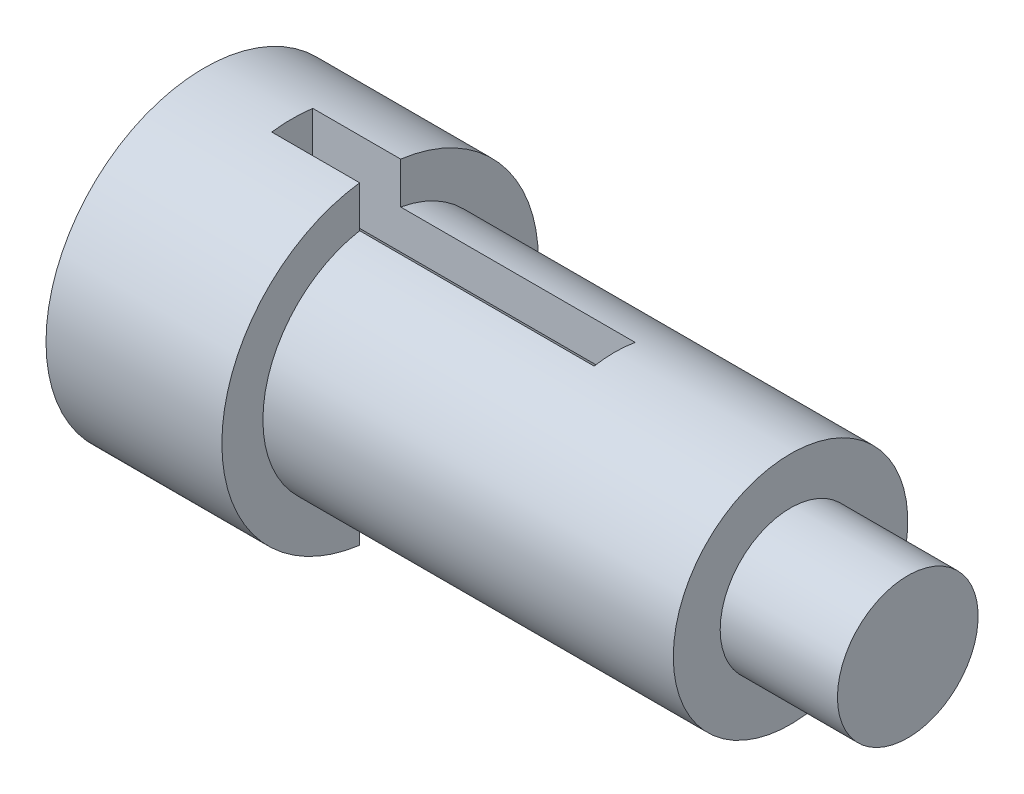
ISO-10303-21;
HEADER;
FILE_DESCRIPTION(('STEP AP214'),'2;1');
FILE_NAME('part.step','',(''),(''),'','','');
FILE_SCHEMA(('AUTOMOTIVE_DESIGN { 1 0 10303 214 1 1 1 1 }'));
ENDSEC;
DATA;
#1=APPLICATION_CONTEXT('core data for automotive mechanical design processes');
#2=APPLICATION_PROTOCOL_DEFINITION('international standard','automotive_design',2000,#1);
#3=PRODUCT_CONTEXT('',#1,'mechanical');
#4=PRODUCT('Part','Part','',(#3));
#5=PRODUCT_RELATED_PRODUCT_CATEGORY('part','',(#4));
#6=PRODUCT_DEFINITION_FORMATION('','',#4);
#7=PRODUCT_DEFINITION_CONTEXT('part definition',#1,'design');
#8=PRODUCT_DEFINITION('design','',#6,#7);
#9=PRODUCT_DEFINITION_SHAPE('','',#8);
#10=(LENGTH_UNIT() NAMED_UNIT(*) SI_UNIT(.MILLI.,.METRE.));
#11=(NAMED_UNIT(*) PLANE_ANGLE_UNIT() SI_UNIT($,.RADIAN.));
#12=(NAMED_UNIT(*) SI_UNIT($,.STERADIAN.) SOLID_ANGLE_UNIT());
#13=UNCERTAINTY_MEASURE_WITH_UNIT(LENGTH_MEASURE(1.E-05),#10,'distance_accuracy_value','');
#14=(GEOMETRIC_REPRESENTATION_CONTEXT(3) GLOBAL_UNCERTAINTY_ASSIGNED_CONTEXT((#13)) GLOBAL_UNIT_ASSIGNED_CONTEXT((#10,
#11,#12)) REPRESENTATION_CONTEXT('',''));
#15=CARTESIAN_POINT('',(0.,0.,0.));
#16=DIRECTION('',(0.,0.,1.));
#17=DIRECTION('',(1.,0.,0.));
#18=AXIS2_PLACEMENT_3D('',#15,#16,#17);
#19=CARTESIAN_POINT('',(30.,0.,-20.));
#20=DIRECTION('',(-1.,0.,0.));
#21=DIRECTION('',(0.,0.,1.));
#22=AXIS2_PLACEMENT_3D('',#19,#20,#21);
#23=PLANE('',#22);
#24=CARTESIAN_POINT('',(30.,0.,0.));
#25=DIRECTION('',(-1.,0.,0.));
#26=DIRECTION('',(0.,0.,1.));
#27=AXIS2_PLACEMENT_3D('',#24,#25,#26);
#28=CIRCLE('',#27,27.);
#29=CARTESIAN_POINT('',(30.,26.7721870604551,-3.49999999999999));
#30=VERTEX_POINT('',#29);
#31=CARTESIAN_POINT('',(30.,-26.7721870604551,-3.49999999999999));
#32=VERTEX_POINT('',#31);
#33=EDGE_CURVE('E220',#30,#32,#28,.T.);
#34=ORIENTED_EDGE('',*,*,#33,.F.);
#35=DIRECTION('',(0.,-1.,0.));
#36=VECTOR('',#35,1.);
#37=CARTESIAN_POINT('',(30.,0.,-3.5));
#38=LINE('',#37,#36);
#39=CARTESIAN_POINT('',(30.,19.6913686675152,-3.5));
#40=VERTEX_POINT('',#39);
#41=EDGE_CURVE('E184',#30,#40,#38,.T.);
#42=ORIENTED_EDGE('',*,*,#41,.T.);
#43=CARTESIAN_POINT('',(30.,0.,0.));
#44=DIRECTION('',(-1.,0.,0.));
#45=DIRECTION('',(0.,0.,1.));
#46=AXIS2_PLACEMENT_3D('',#43,#44,#45);
#47=CIRCLE('',#46,20.);
#48=CARTESIAN_POINT('',(30.,-19.6913686675152,-3.5));
#49=VERTEX_POINT('',#48);
#50=EDGE_CURVE('E223',#40,#49,#47,.T.);
#51=ORIENTED_EDGE('',*,*,#50,.T.);
#52=EDGE_CURVE('E189',#49,#32,#38,.T.);
#53=ORIENTED_EDGE('',*,*,#52,.T.);
#54=EDGE_LOOP('',(#34,#42,#51,#53));
#55=FACE_BOUND('',#54,.T.);
#56=ADVANCED_FACE('F43',(#55),#23,.F.);
#57=CARTESIAN_POINT('',(120.,0.,0.));
#58=DIRECTION('',(-1.,0.,0.));
#59=DIRECTION('',(0.,0.,1.));
#60=AXIS2_PLACEMENT_3D('',#57,#58,#59);
#61=PLANE('',#60);
#62=CARTESIAN_POINT('',(120.,0.,0.));
#63=DIRECTION('',(-1.,0.,0.));
#64=DIRECTION('',(0.,0.,1.));
#65=AXIS2_PLACEMENT_3D('',#62,#63,#64);
#66=CIRCLE('',#65,12.);
#67=CARTESIAN_POINT('',(120.,0.,12.));
#68=VERTEX_POINT('',#67);
#69=EDGE_CURVE('E232',#68,#68,#66,.T.);
#70=ORIENTED_EDGE('',*,*,#69,.F.);
#71=EDGE_LOOP('',(#70));
#72=FACE_BOUND('',#71,.T.);
#73=ADVANCED_FACE('F45',(#72),#61,.F.);
#74=CARTESIAN_POINT('',(0.,0.,0.));
#75=DIRECTION('',(-1.,0.,0.));
#76=DIRECTION('',(0.,0.,1.));
#77=AXIS2_PLACEMENT_3D('',#74,#75,#76);
#78=CYLINDRICAL_SURFACE('',#77,12.);
#79=CARTESIAN_POINT('',(100.,0.,0.));
#80=DIRECTION('',(-1.,0.,0.));
#81=DIRECTION('',(0.,0.,1.));
#82=AXIS2_PLACEMENT_3D('',#79,#80,#81);
#83=CIRCLE('',#82,12.);
#84=CARTESIAN_POINT('',(100.,0.,12.));
#85=VERTEX_POINT('',#84);
#86=EDGE_CURVE('E228',#85,#85,#83,.T.);
#87=ORIENTED_EDGE('',*,*,#86,.F.);
#88=EDGE_LOOP('',(#87));
#89=FACE_BOUND('',#88,.T.);
#90=ORIENTED_EDGE('',*,*,#69,.T.);
#91=EDGE_LOOP('',(#90));
#92=FACE_BOUND('',#91,.T.);
#93=ADVANCED_FACE('F335',(#89,#92),#78,.T.);
#94=CARTESIAN_POINT('',(100.,0.,-12.));
#95=DIRECTION('',(-1.,0.,0.));
#96=DIRECTION('',(0.,0.,1.));
#97=AXIS2_PLACEMENT_3D('',#94,#95,#96);
#98=PLANE('',#97);
#99=CARTESIAN_POINT('',(100.,0.,0.));
#100=DIRECTION('',(-1.,0.,0.));
#101=DIRECTION('',(0.,0.,1.));
#102=AXIS2_PLACEMENT_3D('',#99,#100,#101);
#103=CIRCLE('',#102,20.);
#104=CARTESIAN_POINT('',(100.,0.,20.));
#105=VERTEX_POINT('',#104);
#106=EDGE_CURVE('E224',#105,#105,#103,.T.);
#107=ORIENTED_EDGE('',*,*,#106,.F.);
#108=EDGE_LOOP('',(#107));
#109=FACE_BOUND('',#108,.T.);
#110=ORIENTED_EDGE('',*,*,#86,.T.);
#111=EDGE_LOOP('',(#110));
#112=FACE_BOUND('',#111,.T.);
#113=ADVANCED_FACE('F340',(#109,#112),#98,.F.);
#114=CARTESIAN_POINT('',(0.,0.,0.));
#115=DIRECTION('',(-1.,0.,0.));
#116=DIRECTION('',(0.,0.,1.));
#117=AXIS2_PLACEMENT_3D('',#114,#115,#116);
#118=CYLINDRICAL_SURFACE('',#117,20.);
#119=ORIENTED_EDGE('',*,*,#50,.F.);
#120=DIRECTION('',(-1.,0.,0.));
#121=VECTOR('',#120,1.);
#122=CARTESIAN_POINT('',(0.,19.6913686675152,-3.49999999999999));
#123=LINE('',#122,#121);
#124=CARTESIAN_POINT('',(70.,19.6913686675152,-3.50000000000001));
#125=VERTEX_POINT('',#124);
#126=EDGE_CURVE('E188',#40,#125,#123,.F.);
#127=ORIENTED_EDGE('',*,*,#126,.T.);
#128=CARTESIAN_POINT('',(70.,0.,0.));
#129=DIRECTION('',(1.,0.,0.));
#130=DIRECTION('',(0.,0.,-1.));
#131=AXIS2_PLACEMENT_3D('',#128,#129,#130);
#132=CIRCLE('',#131,20.);
#133=CARTESIAN_POINT('',(70.,19.6913686675152,3.49999999999999));
#134=VERTEX_POINT('',#133);
#135=EDGE_CURVE('E148',#125,#134,#132,.T.);
#136=ORIENTED_EDGE('',*,*,#135,.T.);
#137=DIRECTION('',(-1.,0.,0.));
#138=VECTOR('',#137,1.);
#139=CARTESIAN_POINT('',(0.,19.6913686675152,3.50000000000001));
#140=LINE('',#139,#138);
#141=CARTESIAN_POINT('',(30.,19.6913686675152,3.5));
#142=VERTEX_POINT('',#141);
#143=EDGE_CURVE('E149',#134,#142,#140,.T.);
#144=ORIENTED_EDGE('',*,*,#143,.T.);
#145=CARTESIAN_POINT('',(30.,-19.6913686675152,3.5));
#146=VERTEX_POINT('',#145);
#147=EDGE_CURVE('E165',#146,#142,#47,.T.);
#148=ORIENTED_EDGE('',*,*,#147,.F.);
#149=DIRECTION('',(-1.,0.,0.));
#150=VECTOR('',#149,1.);
#151=CARTESIAN_POINT('',(0.,-19.6913686675152,3.50000000000001));
#152=LINE('',#151,#150);
#153=CARTESIAN_POINT('',(70.,-19.6913686675152,3.49999999999999));
#154=VERTEX_POINT('',#153);
#155=EDGE_CURVE('E152',#146,#154,#152,.F.);
#156=ORIENTED_EDGE('',*,*,#155,.T.);
#157=CARTESIAN_POINT('',(70.,-19.6913686675152,-3.50000000000001));
#158=VERTEX_POINT('',#157);
#159=EDGE_CURVE('E137',#154,#158,#132,.T.);
#160=ORIENTED_EDGE('',*,*,#159,.T.);
#161=DIRECTION('',(-1.,0.,0.));
#162=VECTOR('',#161,1.);
#163=CARTESIAN_POINT('',(0.,-19.6913686675152,-3.49999999999999));
#164=LINE('',#163,#162);
#165=EDGE_CURVE('E197',#158,#49,#164,.T.);
#166=ORIENTED_EDGE('',*,*,#165,.T.);
#167=EDGE_LOOP('',(#119,#127,#136,#144,#148,#156,#160,#166));
#168=FACE_BOUND('',#167,.T.);
#169=ORIENTED_EDGE('',*,*,#106,.T.);
#170=EDGE_LOOP('',(#169));
#171=FACE_BOUND('',#170,.T.);
#172=ADVANCED_FACE('F161',(#168,#171),#118,.T.);
#173=CARTESIAN_POINT('',(30.,-26.7721870604551,3.50000000000001));
#174=VERTEX_POINT('',#173);
#175=CARTESIAN_POINT('',(30.,26.7721870604551,3.50000000000001));
#176=VERTEX_POINT('',#175);
#177=EDGE_CURVE('E216',#174,#176,#28,.T.);
#178=ORIENTED_EDGE('',*,*,#177,.F.);
#179=DIRECTION('',(0.,1.,0.));
#180=VECTOR('',#179,1.);
#181=CARTESIAN_POINT('',(30.,0.,3.5));
#182=LINE('',#181,#180);
#183=EDGE_CURVE('E69',#174,#146,#182,.T.);
#184=ORIENTED_EDGE('',*,*,#183,.T.);
#185=ORIENTED_EDGE('',*,*,#147,.T.);
#186=EDGE_CURVE('E172',#142,#176,#182,.T.);
#187=ORIENTED_EDGE('',*,*,#186,.T.);
#188=EDGE_LOOP('',(#178,#184,#185,#187));
#189=FACE_BOUND('',#188,.T.);
#190=ADVANCED_FACE('F294',(#189),#23,.F.);
#191=CARTESIAN_POINT('',(0.,0.,0.));
#192=DIRECTION('',(-1.,0.,0.));
#193=DIRECTION('',(0.,0.,1.));
#194=AXIS2_PLACEMENT_3D('',#191,#192,#193);
#195=CYLINDRICAL_SURFACE('',#194,27.);
#196=CARTESIAN_POINT('',(0.,0.,0.));
#197=DIRECTION('',(-1.,0.,0.));
#198=DIRECTION('',(0.,0.,1.));
#199=AXIS2_PLACEMENT_3D('',#196,#197,#198);
#200=CIRCLE('',#199,27.);
#201=CARTESIAN_POINT('',(0.,0.,27.));
#202=VERTEX_POINT('',#201);
#203=EDGE_CURVE('E212',#202,#202,#200,.T.);
#204=ORIENTED_EDGE('',*,*,#203,.F.);
#205=EDGE_LOOP('',(#204));
#206=FACE_BOUND('',#205,.T.);
#207=DIRECTION('',(-1.,0.,0.));
#208=VECTOR('',#207,1.);
#209=CARTESIAN_POINT('',(0.,-26.7721870604551,-3.49999999999999));
#210=LINE('',#209,#208);
#211=CARTESIAN_POINT('',(15.,-26.7721870604551,-3.5));
#212=VERTEX_POINT('',#211);
#213=EDGE_CURVE('E193',#32,#212,#210,.T.);
#214=ORIENTED_EDGE('',*,*,#213,.T.);
#215=CARTESIAN_POINT('',(15.,0.,0.));
#216=DIRECTION('',(-1.,0.,0.));
#217=DIRECTION('',(0.,0.,1.));
#218=AXIS2_PLACEMENT_3D('',#215,#216,#217);
#219=CIRCLE('',#218,27.);
#220=CARTESIAN_POINT('',(15.,-26.7721870604551,3.5));
#221=VERTEX_POINT('',#220);
#222=EDGE_CURVE('E200',#212,#221,#219,.T.);
#223=ORIENTED_EDGE('',*,*,#222,.T.);
#224=DIRECTION('',(-1.,0.,0.));
#225=VECTOR('',#224,1.);
#226=CARTESIAN_POINT('',(0.,-26.7721870604551,3.50000000000001));
#227=LINE('',#226,#225);
#228=EDGE_CURVE('E174',#221,#174,#227,.F.);
#229=ORIENTED_EDGE('',*,*,#228,.T.);
#230=ORIENTED_EDGE('',*,*,#177,.T.);
#231=DIRECTION('',(-1.,0.,0.));
#232=VECTOR('',#231,1.);
#233=CARTESIAN_POINT('',(0.,26.7721870604551,3.50000000000001));
#234=LINE('',#233,#232);
#235=CARTESIAN_POINT('',(15.,26.7721870604551,3.50000000000001));
#236=VERTEX_POINT('',#235);
#237=EDGE_CURVE('E167',#176,#236,#234,.T.);
#238=ORIENTED_EDGE('',*,*,#237,.T.);
#239=CARTESIAN_POINT('',(15.,26.7721870604551,-3.5));
#240=VERTEX_POINT('',#239);
#241=EDGE_CURVE('E201',#236,#240,#219,.T.);
#242=ORIENTED_EDGE('',*,*,#241,.T.);
#243=DIRECTION('',(-1.,0.,0.));
#244=VECTOR('',#243,1.);
#245=CARTESIAN_POINT('',(0.,26.7721870604551,-3.49999999999999));
#246=LINE('',#245,#244);
#247=EDGE_CURVE('E180',#240,#30,#246,.F.);
#248=ORIENTED_EDGE('',*,*,#247,.T.);
#249=ORIENTED_EDGE('',*,*,#33,.T.);
#250=EDGE_LOOP('',(#214,#223,#229,#230,#238,#242,#248,#249));
#251=FACE_BOUND('',#250,.T.);
#252=ADVANCED_FACE('F290',(#206,#251),#195,.T.);
#253=CARTESIAN_POINT('',(0.,0.,-27.));
#254=DIRECTION('',(1.,0.,0.));
#255=DIRECTION('',(0.,0.,-1.));
#256=AXIS2_PLACEMENT_3D('',#253,#254,#255);
#257=PLANE('',#256);
#258=CARTESIAN_POINT('',(0.,0.,0.));
#259=DIRECTION('',(-1.,0.,0.));
#260=DIRECTION('',(0.,0.,1.));
#261=AXIS2_PLACEMENT_3D('',#258,#259,#260);
#262=CIRCLE('',#261,13.5);
#263=CARTESIAN_POINT('',(0.,0.,13.5));
#264=VERTEX_POINT('',#263);
#265=EDGE_CURVE('E208',#264,#264,#262,.T.);
#266=ORIENTED_EDGE('',*,*,#265,.F.);
#267=EDGE_LOOP('',(#266));
#268=FACE_BOUND('',#267,.T.);
#269=ORIENTED_EDGE('',*,*,#203,.T.);
#270=EDGE_LOOP('',(#269));
#271=FACE_BOUND('',#270,.T.);
#272=ADVANCED_FACE('F314',(#268,#271),#257,.F.);
#273=CARTESIAN_POINT('',(0.,0.,0.));
#274=DIRECTION('',(-1.,0.,0.));
#275=DIRECTION('',(0.,0.,1.));
#276=AXIS2_PLACEMENT_3D('',#273,#274,#275);
#277=CYLINDRICAL_SURFACE('',#276,13.5);
#278=DIRECTION('',(-1.,0.,0.));
#279=VECTOR('',#278,1.);
#280=CARTESIAN_POINT('',(0.,13.0384048104053,-3.49999999999999));
#281=LINE('',#280,#279);
#282=CARTESIAN_POINT('',(70.,13.0384048104053,-3.50000000000001));
#283=VERTEX_POINT('',#282);
#284=CARTESIAN_POINT('',(15.,13.0384048104053,-3.5));
#285=VERTEX_POINT('',#284);
#286=EDGE_CURVE('E47',#283,#285,#281,.T.);
#287=ORIENTED_EDGE('',*,*,#286,.T.);
#288=CARTESIAN_POINT('',(15.,0.,0.));
#289=DIRECTION('',(-1.,0.,0.));
#290=DIRECTION('',(0.,0.,1.));
#291=AXIS2_PLACEMENT_3D('',#288,#289,#290);
#292=CIRCLE('',#291,13.5);
#293=CARTESIAN_POINT('',(15.,13.0384048104053,3.5));
#294=VERTEX_POINT('',#293);
#295=EDGE_CURVE('E11',#285,#294,#292,.F.);
#296=ORIENTED_EDGE('',*,*,#295,.T.);
#297=DIRECTION('',(-1.,0.,0.));
#298=VECTOR('',#297,1.);
#299=CARTESIAN_POINT('',(0.,13.0384048104053,3.50000000000001));
#300=LINE('',#299,#298);
#301=CARTESIAN_POINT('',(70.,13.0384048104053,3.50000000000001));
#302=VERTEX_POINT('',#301);
#303=EDGE_CURVE('E247',#294,#302,#300,.F.);
#304=ORIENTED_EDGE('',*,*,#303,.T.);
#305=CARTESIAN_POINT('',(70.,0.,0.));
#306=DIRECTION('',(1.,0.,0.));
#307=DIRECTION('',(0.,0.,-1.));
#308=AXIS2_PLACEMENT_3D('',#305,#306,#307);
#309=CIRCLE('',#308,13.5);
#310=EDGE_CURVE('E242',#302,#283,#309,.F.);
#311=ORIENTED_EDGE('',*,*,#310,.T.);
#312=EDGE_LOOP('',(#287,#296,#304,#311));
#313=FACE_BOUND('',#312,.T.);
#314=DIRECTION('',(-1.,0.,0.));
#315=VECTOR('',#314,1.);
#316=CARTESIAN_POINT('',(0.,-13.0384048104053,3.50000000000001));
#317=LINE('',#316,#315);
#318=CARTESIAN_POINT('',(70.,-13.0384048104053,3.49999999999999));
#319=VERTEX_POINT('',#318);
#320=CARTESIAN_POINT('',(15.,-13.0384048104053,3.50000000000001));
#321=VERTEX_POINT('',#320);
#322=EDGE_CURVE('E154',#319,#321,#317,.T.);
#323=ORIENTED_EDGE('',*,*,#322,.T.);
#324=CARTESIAN_POINT('',(15.,-13.0384048104053,-3.5));
#325=VERTEX_POINT('',#324);
#326=EDGE_CURVE('E54',#321,#325,#292,.F.);
#327=ORIENTED_EDGE('',*,*,#326,.T.);
#328=DIRECTION('',(-1.,0.,0.));
#329=VECTOR('',#328,1.);
#330=CARTESIAN_POINT('',(0.,-13.0384048104053,-3.49999999999999));
#331=LINE('',#330,#329);
#332=CARTESIAN_POINT('',(70.,-13.0384048104053,-3.50000000000001));
#333=VERTEX_POINT('',#332);
#334=EDGE_CURVE('E241',#325,#333,#331,.F.);
#335=ORIENTED_EDGE('',*,*,#334,.T.);
#336=EDGE_CURVE('E238',#333,#319,#309,.F.);
#337=ORIENTED_EDGE('',*,*,#336,.T.);
#338=EDGE_LOOP('',(#323,#327,#335,#337));
#339=FACE_BOUND('',#338,.T.);
#340=CARTESIAN_POINT('',(85.,0.,0.));
#341=DIRECTION('',(-1.,0.,0.));
#342=DIRECTION('',(0.,0.,1.));
#343=AXIS2_PLACEMENT_3D('',#340,#341,#342);
#344=CIRCLE('',#343,13.5);
#345=CARTESIAN_POINT('',(85.,0.,13.5));
#346=VERTEX_POINT('',#345);
#347=EDGE_CURVE('E204',#346,#346,#344,.T.);
#348=ORIENTED_EDGE('',*,*,#347,.F.);
#349=EDGE_LOOP('',(#348));
#350=FACE_BOUND('',#349,.T.);
#351=ORIENTED_EDGE('',*,*,#265,.T.);
#352=EDGE_LOOP('',(#351));
#353=FACE_BOUND('',#352,.T.);
#354=ADVANCED_FACE('F256',(#313,#339,#350,#353),#277,.F.);
#355=CARTESIAN_POINT('',(85.,0.,-13.5));
#356=DIRECTION('',(1.,0.,0.));
#357=DIRECTION('',(0.,0.,-1.));
#358=AXIS2_PLACEMENT_3D('',#355,#356,#357);
#359=PLANE('',#358);
#360=ORIENTED_EDGE('',*,*,#347,.T.);
#361=EDGE_LOOP('',(#360));
#362=FACE_BOUND('',#361,.T.);
#363=ADVANCED_FACE('F313',(#362),#359,.F.);
#364=CARTESIAN_POINT('',(70.,-27.,3.49999999999999));
#365=DIRECTION('',(0.,0.,1.));
#366=DIRECTION('',(1.,0.,0.));
#367=AXIS2_PLACEMENT_3D('',#364,#365,#366);
#368=PLANE('',#367);
#369=ORIENTED_EDGE('',*,*,#183,.F.);
#370=ORIENTED_EDGE('',*,*,#228,.F.);
#371=DIRECTION('',(0.,1.,0.));
#372=VECTOR('',#371,1.);
#373=CARTESIAN_POINT('',(15.,-27.,3.5));
#374=LINE('',#373,#372);
#375=EDGE_CURVE('E276',#221,#321,#374,.T.);
#376=ORIENTED_EDGE('',*,*,#375,.T.);
#377=ORIENTED_EDGE('',*,*,#322,.F.);
#378=DIRECTION('',(0.,1.,0.));
#379=VECTOR('',#378,1.);
#380=CARTESIAN_POINT('',(70.,-27.,3.49999999999999));
#381=LINE('',#380,#379);
#382=EDGE_CURVE('E140',#154,#319,#381,.T.);
#383=ORIENTED_EDGE('',*,*,#382,.F.);
#384=ORIENTED_EDGE('',*,*,#155,.F.);
#385=EDGE_LOOP('',(#369,#370,#376,#377,#383,#384));
#386=FACE_BOUND('',#385,.T.);
#387=ADVANCED_FACE('F151',(#386),#368,.F.);
#388=CARTESIAN_POINT('',(70.,-27.,3.49999999999999));
#389=DIRECTION('',(1.,0.,0.));
#390=DIRECTION('',(0.,0.,-1.));
#391=AXIS2_PLACEMENT_3D('',#388,#389,#390);
#392=PLANE('',#391);
#393=ORIENTED_EDGE('',*,*,#382,.T.);
#394=ORIENTED_EDGE('',*,*,#336,.F.);
#395=DIRECTION('',(0.,1.,0.));
#396=VECTOR('',#395,1.);
#397=CARTESIAN_POINT('',(70.,-27.,-3.50000000000001));
#398=LINE('',#397,#396);
#399=EDGE_CURVE('E143',#158,#333,#398,.T.);
#400=ORIENTED_EDGE('',*,*,#399,.F.);
#401=ORIENTED_EDGE('',*,*,#159,.F.);
#402=EDGE_LOOP('',(#393,#394,#400,#401));
#403=FACE_BOUND('',#402,.T.);
#404=ADVANCED_FACE('F139',(#403),#392,.F.);
#405=CARTESIAN_POINT('',(70.,-27.,-3.50000000000001));
#406=DIRECTION('',(0.,0.,-1.));
#407=DIRECTION('',(-1.,0.,0.));
#408=AXIS2_PLACEMENT_3D('',#405,#406,#407);
#409=PLANE('',#408);
#410=ORIENTED_EDGE('',*,*,#399,.T.);
#411=ORIENTED_EDGE('',*,*,#334,.F.);
#412=DIRECTION('',(0.,1.,0.));
#413=VECTOR('',#412,1.);
#414=CARTESIAN_POINT('',(15.,-27.,-3.5));
#415=LINE('',#414,#413);
#416=EDGE_CURVE('E279',#212,#325,#415,.T.);
#417=ORIENTED_EDGE('',*,*,#416,.F.);
#418=ORIENTED_EDGE('',*,*,#213,.F.);
#419=ORIENTED_EDGE('',*,*,#52,.F.);
#420=ORIENTED_EDGE('',*,*,#165,.F.);
#421=EDGE_LOOP('',(#410,#411,#417,#418,#419,#420));
#422=FACE_BOUND('',#421,.T.);
#423=ADVANCED_FACE('F307',(#422),#409,.F.);
#424=CARTESIAN_POINT('',(15.,-27.,3.5));
#425=DIRECTION('',(-1.,0.,0.));
#426=DIRECTION('',(0.,0.,1.));
#427=AXIS2_PLACEMENT_3D('',#424,#425,#426);
#428=PLANE('',#427);
#429=ORIENTED_EDGE('',*,*,#416,.T.);
#430=ORIENTED_EDGE('',*,*,#326,.F.);
#431=ORIENTED_EDGE('',*,*,#375,.F.);
#432=ORIENTED_EDGE('',*,*,#222,.F.);
#433=EDGE_LOOP('',(#429,#430,#431,#432));
#434=FACE_BOUND('',#433,.T.);
#435=ADVANCED_FACE('F309',(#434),#428,.F.);
#436=EDGE_CURVE('E61',#294,#236,#374,.T.);
#437=ORIENTED_EDGE('',*,*,#436,.F.);
#438=ORIENTED_EDGE('',*,*,#295,.F.);
#439=EDGE_CURVE('E265',#285,#240,#415,.T.);
#440=ORIENTED_EDGE('',*,*,#439,.T.);
#441=ORIENTED_EDGE('',*,*,#241,.F.);
#442=EDGE_LOOP('',(#437,#438,#440,#441));
#443=FACE_BOUND('',#442,.T.);
#444=ADVANCED_FACE('F289',(#443),#428,.F.);
#445=ORIENTED_EDGE('',*,*,#41,.F.);
#446=ORIENTED_EDGE('',*,*,#247,.F.);
#447=ORIENTED_EDGE('',*,*,#439,.F.);
#448=ORIENTED_EDGE('',*,*,#286,.F.);
#449=EDGE_CURVE('E156',#283,#125,#398,.T.);
#450=ORIENTED_EDGE('',*,*,#449,.T.);
#451=ORIENTED_EDGE('',*,*,#126,.F.);
#452=EDGE_LOOP('',(#445,#446,#447,#448,#450,#451));
#453=FACE_BOUND('',#452,.T.);
#454=ADVANCED_FACE('F262',(#453),#409,.F.);
#455=ORIENTED_EDGE('',*,*,#449,.F.);
#456=ORIENTED_EDGE('',*,*,#310,.F.);
#457=EDGE_CURVE('E157',#302,#134,#381,.T.);
#458=ORIENTED_EDGE('',*,*,#457,.T.);
#459=ORIENTED_EDGE('',*,*,#135,.F.);
#460=EDGE_LOOP('',(#455,#456,#458,#459));
#461=FACE_BOUND('',#460,.T.);
#462=ADVANCED_FACE('F267',(#461),#392,.F.);
#463=ORIENTED_EDGE('',*,*,#457,.F.);
#464=ORIENTED_EDGE('',*,*,#303,.F.);
#465=ORIENTED_EDGE('',*,*,#436,.T.);
#466=ORIENTED_EDGE('',*,*,#237,.F.);
#467=ORIENTED_EDGE('',*,*,#186,.F.);
#468=ORIENTED_EDGE('',*,*,#143,.F.);
#469=EDGE_LOOP('',(#463,#464,#465,#466,#467,#468));
#470=FACE_BOUND('',#469,.T.);
#471=ADVANCED_FACE('F292',(#470),#368,.F.);
#472=CLOSED_SHELL('',(#56,#73,#93,#113,#172,#190,#252,#272,#354,#363,#387,#404,#423,#435,#444,
#454,#462,#471));
#473=MANIFOLD_SOLID_BREP('B2',#472);
#474=ADVANCED_BREP_SHAPE_REPRESENTATION('',(#18,#473),#14);
#475=SHAPE_DEFINITION_REPRESENTATION(#9,#474);
ENDSEC;
END-ISO-10303-21;
